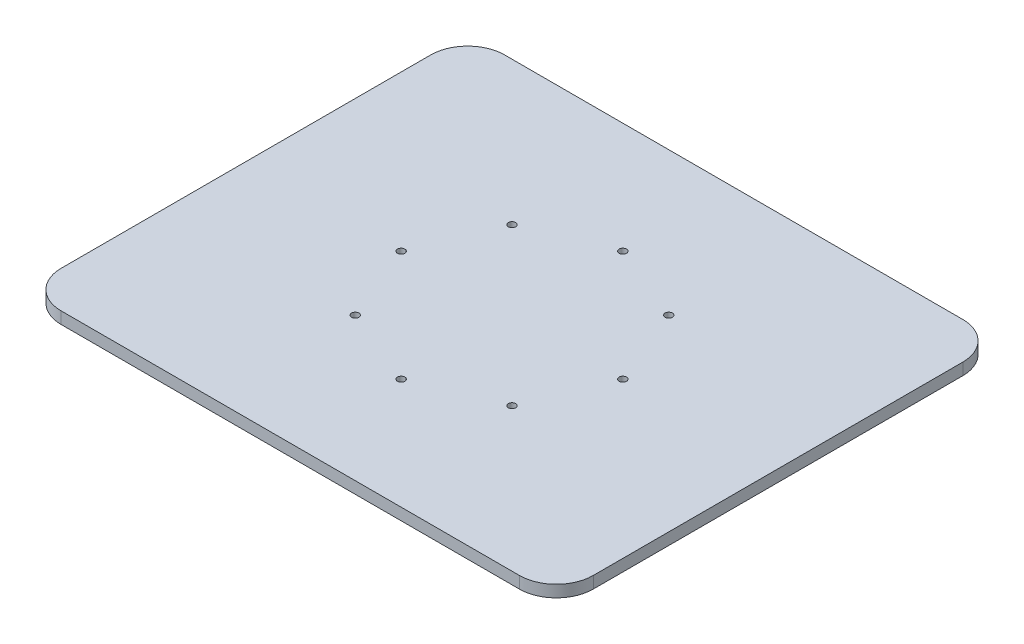
ISO-10303-21;
HEADER;
FILE_DESCRIPTION(('STEP AP214'),'2;1');
FILE_NAME('part.step','',(''),(''),'','','');
FILE_SCHEMA(('AUTOMOTIVE_DESIGN { 1 0 10303 214 1 1 1 1 }'));
ENDSEC;
DATA;
#1=APPLICATION_CONTEXT('core data for automotive mechanical design processes');
#2=APPLICATION_PROTOCOL_DEFINITION('international standard','automotive_design',2000,#1);
#3=PRODUCT_CONTEXT('',#1,'mechanical');
#4=PRODUCT('Part','Part','',(#3));
#5=PRODUCT_RELATED_PRODUCT_CATEGORY('part','',(#4));
#6=PRODUCT_DEFINITION_FORMATION('','',#4);
#7=PRODUCT_DEFINITION_CONTEXT('part definition',#1,'design');
#8=PRODUCT_DEFINITION('design','',#6,#7);
#9=PRODUCT_DEFINITION_SHAPE('','',#8);
#10=(LENGTH_UNIT() NAMED_UNIT(*) SI_UNIT(.MILLI.,.METRE.));
#11=(NAMED_UNIT(*) PLANE_ANGLE_UNIT() SI_UNIT($,.RADIAN.));
#12=(NAMED_UNIT(*) SI_UNIT($,.STERADIAN.) SOLID_ANGLE_UNIT());
#13=UNCERTAINTY_MEASURE_WITH_UNIT(LENGTH_MEASURE(1.E-05),#10,'distance_accuracy_value','');
#14=(GEOMETRIC_REPRESENTATION_CONTEXT(3) GLOBAL_UNCERTAINTY_ASSIGNED_CONTEXT((#13)) GLOBAL_UNIT_ASSIGNED_CONTEXT((#10,
#11,#12)) REPRESENTATION_CONTEXT('',''));
#15=CARTESIAN_POINT('',(0.,0.,0.));
#16=DIRECTION('',(0.,0.,1.));
#17=DIRECTION('',(1.,0.,0.));
#18=AXIS2_PLACEMENT_3D('',#15,#16,#17);
#19=CARTESIAN_POINT('',(-360.,0.,-300.));
#20=DIRECTION('',(-1.,0.,0.));
#21=DIRECTION('',(0.,0.,1.));
#22=AXIS2_PLACEMENT_3D('',#19,#20,#21);
#23=PLANE('',#22);
#24=DIRECTION('',(0.,0.,1.));
#25=VECTOR('',#24,1.);
#26=CARTESIAN_POINT('',(-360.,0.,-300.));
#27=LINE('',#26,#25);
#28=CARTESIAN_POINT('',(-360.,0.,-250.));
#29=VERTEX_POINT('',#28);
#30=CARTESIAN_POINT('',(-360.,0.,250.));
#31=VERTEX_POINT('',#30);
#32=EDGE_CURVE('E181',#29,#31,#27,.T.);
#33=ORIENTED_EDGE('',*,*,#32,.T.);
#34=DIRECTION('',(0.,1.,0.));
#35=VECTOR('',#34,1.);
#36=CARTESIAN_POINT('',(-360.,0.,250.));
#37=LINE('',#36,#35);
#38=CARTESIAN_POINT('',(-360.,16.,250.));
#39=VERTEX_POINT('',#38);
#40=EDGE_CURVE('E11',#31,#39,#37,.T.);
#41=ORIENTED_EDGE('',*,*,#40,.T.);
#42=DIRECTION('',(0.,0.,1.));
#43=VECTOR('',#42,1.);
#44=CARTESIAN_POINT('',(-360.,16.,-300.));
#45=LINE('',#44,#43);
#46=CARTESIAN_POINT('',(-360.,16.,-250.));
#47=VERTEX_POINT('',#46);
#48=EDGE_CURVE('E188',#47,#39,#45,.T.);
#49=ORIENTED_EDGE('',*,*,#48,.F.);
#50=DIRECTION('',(0.,1.,0.));
#51=VECTOR('',#50,1.);
#52=CARTESIAN_POINT('',(-360.,0.,-250.));
#53=LINE('',#52,#51);
#54=EDGE_CURVE('E53',#47,#29,#53,.F.);
#55=ORIENTED_EDGE('',*,*,#54,.T.);
#56=EDGE_LOOP('',(#33,#41,#49,#55));
#57=FACE_BOUND('',#56,.T.);
#58=ADVANCED_FACE('F44',(#57),#23,.T.);
#59=CARTESIAN_POINT('',(360.,0.,-300.));
#60=DIRECTION('',(0.,0.,-1.));
#61=DIRECTION('',(-1.,0.,0.));
#62=AXIS2_PLACEMENT_3D('',#59,#60,#61);
#63=PLANE('',#62);
#64=DIRECTION('',(-1.,0.,0.));
#65=VECTOR('',#64,1.);
#66=CARTESIAN_POINT('',(360.,16.,-300.));
#67=LINE('',#66,#65);
#68=CARTESIAN_POINT('',(310.,16.,-300.));
#69=VERTEX_POINT('',#68);
#70=CARTESIAN_POINT('',(-310.,16.,-300.));
#71=VERTEX_POINT('',#70);
#72=EDGE_CURVE('E132',#69,#71,#67,.T.);
#73=ORIENTED_EDGE('',*,*,#72,.F.);
#74=DIRECTION('',(0.,1.,0.));
#75=VECTOR('',#74,1.);
#76=CARTESIAN_POINT('',(310.,0.,-300.));
#77=LINE('',#76,#75);
#78=CARTESIAN_POINT('',(310.,0.,-300.));
#79=VERTEX_POINT('',#78);
#80=EDGE_CURVE('E157',#69,#79,#77,.F.);
#81=ORIENTED_EDGE('',*,*,#80,.T.);
#82=DIRECTION('',(-1.,0.,0.));
#83=VECTOR('',#82,1.);
#84=CARTESIAN_POINT('',(360.,0.,-300.));
#85=LINE('',#84,#83);
#86=CARTESIAN_POINT('',(-310.,0.,-300.));
#87=VERTEX_POINT('',#86);
#88=EDGE_CURVE('E138',#79,#87,#85,.T.);
#89=ORIENTED_EDGE('',*,*,#88,.T.);
#90=DIRECTION('',(0.,1.,0.));
#91=VECTOR('',#90,1.);
#92=CARTESIAN_POINT('',(-310.,0.,-300.));
#93=LINE('',#92,#91);
#94=EDGE_CURVE('E154',#87,#71,#93,.T.);
#95=ORIENTED_EDGE('',*,*,#94,.T.);
#96=EDGE_LOOP('',(#73,#81,#89,#95));
#97=FACE_BOUND('',#96,.T.);
#98=ADVANCED_FACE('F200',(#97),#63,.T.);
#99=CARTESIAN_POINT('',(360.,0.,300.));
#100=DIRECTION('',(1.,0.,0.));
#101=DIRECTION('',(0.,0.,-1.));
#102=AXIS2_PLACEMENT_3D('',#99,#100,#101);
#103=PLANE('',#102);
#104=DIRECTION('',(0.,0.,-1.));
#105=VECTOR('',#104,1.);
#106=CARTESIAN_POINT('',(360.,0.,300.));
#107=LINE('',#106,#105);
#108=CARTESIAN_POINT('',(360.,0.,250.));
#109=VERTEX_POINT('',#108);
#110=CARTESIAN_POINT('',(360.,0.,-250.));
#111=VERTEX_POINT('',#110);
#112=EDGE_CURVE('E144',#109,#111,#107,.T.);
#113=ORIENTED_EDGE('',*,*,#112,.T.);
#114=DIRECTION('',(0.,1.,0.));
#115=VECTOR('',#114,1.);
#116=CARTESIAN_POINT('',(360.,0.,-250.));
#117=LINE('',#116,#115);
#118=CARTESIAN_POINT('',(360.,16.,-250.));
#119=VERTEX_POINT('',#118);
#120=EDGE_CURVE('E135',#111,#119,#117,.T.);
#121=ORIENTED_EDGE('',*,*,#120,.T.);
#122=DIRECTION('',(0.,0.,-1.));
#123=VECTOR('',#122,1.);
#124=CARTESIAN_POINT('',(360.,16.,300.));
#125=LINE('',#124,#123);
#126=CARTESIAN_POINT('',(360.,16.,250.));
#127=VERTEX_POINT('',#126);
#128=EDGE_CURVE('E118',#127,#119,#125,.T.);
#129=ORIENTED_EDGE('',*,*,#128,.F.);
#130=DIRECTION('',(0.,1.,0.));
#131=VECTOR('',#130,1.);
#132=CARTESIAN_POINT('',(360.,0.,250.));
#133=LINE('',#132,#131);
#134=EDGE_CURVE('E128',#127,#109,#133,.F.);
#135=ORIENTED_EDGE('',*,*,#134,.T.);
#136=EDGE_LOOP('',(#113,#121,#129,#135));
#137=FACE_BOUND('',#136,.T.);
#138=ADVANCED_FACE('F129',(#137),#103,.T.);
#139=CARTESIAN_POINT('',(-360.,0.,300.));
#140=DIRECTION('',(0.,0.,1.));
#141=DIRECTION('',(1.,0.,0.));
#142=AXIS2_PLACEMENT_3D('',#139,#140,#141);
#143=PLANE('',#142);
#144=DIRECTION('',(1.,0.,0.));
#145=VECTOR('',#144,1.);
#146=CARTESIAN_POINT('',(-360.,0.,300.));
#147=LINE('',#146,#145);
#148=CARTESIAN_POINT('',(-310.,0.,300.));
#149=VERTEX_POINT('',#148);
#150=CARTESIAN_POINT('',(310.,0.,300.));
#151=VERTEX_POINT('',#150);
#152=EDGE_CURVE('E193',#149,#151,#147,.T.);
#153=ORIENTED_EDGE('',*,*,#152,.T.);
#154=DIRECTION('',(0.,1.,0.));
#155=VECTOR('',#154,1.);
#156=CARTESIAN_POINT('',(310.,0.,300.));
#157=LINE('',#156,#155);
#158=CARTESIAN_POINT('',(310.,16.,300.));
#159=VERTEX_POINT('',#158);
#160=EDGE_CURVE('E174',#151,#159,#157,.T.);
#161=ORIENTED_EDGE('',*,*,#160,.T.);
#162=DIRECTION('',(1.,0.,0.));
#163=VECTOR('',#162,1.);
#164=CARTESIAN_POINT('',(-360.,16.,300.));
#165=LINE('',#164,#163);
#166=CARTESIAN_POINT('',(-310.,16.,300.));
#167=VERTEX_POINT('',#166);
#168=EDGE_CURVE('E120',#167,#159,#165,.T.);
#169=ORIENTED_EDGE('',*,*,#168,.F.);
#170=DIRECTION('',(0.,1.,0.));
#171=VECTOR('',#170,1.);
#172=CARTESIAN_POINT('',(-310.,0.,300.));
#173=LINE('',#172,#171);
#174=EDGE_CURVE('E68',#167,#149,#173,.F.);
#175=ORIENTED_EDGE('',*,*,#174,.T.);
#176=EDGE_LOOP('',(#153,#161,#169,#175));
#177=FACE_BOUND('',#176,.T.);
#178=ADVANCED_FACE('F361',(#177),#143,.T.);
#179=CARTESIAN_POINT('',(0.,0.,0.));
#180=DIRECTION('',(0.,1.,0.));
#181=DIRECTION('',(0.,0.,1.));
#182=AXIS2_PLACEMENT_3D('',#179,#180,#181);
#183=PLANE('',#182);
#184=CARTESIAN_POINT('',(106.066017178,0.,106.066017178));
#185=DIRECTION('',(0.,1.,0.));
#186=DIRECTION('',(0.,0.,1.));
#187=AXIS2_PLACEMENT_3D('',#184,#185,#186);
#188=CIRCLE('',#187,2.75000000000002);
#189=CARTESIAN_POINT('',(106.066017178,0.,108.816017178));
#190=VERTEX_POINT('',#189);
#191=EDGE_CURVE('E317',#190,#190,#188,.T.);
#192=ORIENTED_EDGE('',*,*,#191,.T.);
#193=EDGE_LOOP('',(#192));
#194=FACE_BOUND('',#193,.T.);
#195=CARTESIAN_POINT('',(0.,0.,150.));
#196=DIRECTION('',(0.,1.,0.));
#197=DIRECTION('',(0.,0.,1.));
#198=AXIS2_PLACEMENT_3D('',#195,#196,#197);
#199=CIRCLE('',#198,2.75000000000001);
#200=CARTESIAN_POINT('',(0.,0.,152.75));
#201=VERTEX_POINT('',#200);
#202=EDGE_CURVE('E303',#201,#201,#199,.T.);
#203=ORIENTED_EDGE('',*,*,#202,.T.);
#204=EDGE_LOOP('',(#203));
#205=FACE_BOUND('',#204,.T.);
#206=CARTESIAN_POINT('',(-106.066017178,0.,106.066017178));
#207=DIRECTION('',(0.,1.,0.));
#208=DIRECTION('',(0.,0.,1.));
#209=AXIS2_PLACEMENT_3D('',#206,#207,#208);
#210=CIRCLE('',#209,2.75000000000002);
#211=CARTESIAN_POINT('',(-106.066017178,0.,108.816017178));
#212=VERTEX_POINT('',#211);
#213=EDGE_CURVE('E290',#212,#212,#210,.T.);
#214=ORIENTED_EDGE('',*,*,#213,.T.);
#215=EDGE_LOOP('',(#214));
#216=FACE_BOUND('',#215,.T.);
#217=CARTESIAN_POINT('',(-150.,0.,0.));
#218=DIRECTION('',(0.,1.,0.));
#219=DIRECTION('',(0.,0.,1.));
#220=AXIS2_PLACEMENT_3D('',#217,#218,#219);
#221=CIRCLE('',#220,2.75);
#222=CARTESIAN_POINT('',(-150.,0.,2.74999999999998));
#223=VERTEX_POINT('',#222);
#224=EDGE_CURVE('E271',#223,#223,#221,.T.);
#225=ORIENTED_EDGE('',*,*,#224,.T.);
#226=EDGE_LOOP('',(#225));
#227=FACE_BOUND('',#226,.T.);
#228=CARTESIAN_POINT('',(-106.066017178,0.,-106.066017178));
#229=DIRECTION('',(0.,1.,0.));
#230=DIRECTION('',(0.,0.,1.));
#231=AXIS2_PLACEMENT_3D('',#228,#229,#230);
#232=CIRCLE('',#231,2.75000000000002);
#233=CARTESIAN_POINT('',(-106.066017178,0.,-103.316017178));
#234=VERTEX_POINT('',#233);
#235=EDGE_CURVE('E254',#234,#234,#232,.T.);
#236=ORIENTED_EDGE('',*,*,#235,.T.);
#237=EDGE_LOOP('',(#236));
#238=FACE_BOUND('',#237,.T.);
#239=CARTESIAN_POINT('',(0.,0.,-150.));
#240=DIRECTION('',(0.,1.,0.));
#241=DIRECTION('',(0.,0.,1.));
#242=AXIS2_PLACEMENT_3D('',#239,#240,#241);
#243=CIRCLE('',#242,2.75000000000001);
#244=CARTESIAN_POINT('',(0.,0.,-147.25));
#245=VERTEX_POINT('',#244);
#246=EDGE_CURVE('E239',#245,#245,#243,.T.);
#247=ORIENTED_EDGE('',*,*,#246,.T.);
#248=EDGE_LOOP('',(#247));
#249=FACE_BOUND('',#248,.T.);
#250=CARTESIAN_POINT('',(106.066017178,0.,-106.066017178));
#251=DIRECTION('',(0.,1.,0.));
#252=DIRECTION('',(0.,0.,1.));
#253=AXIS2_PLACEMENT_3D('',#250,#251,#252);
#254=CIRCLE('',#253,2.75000000000002);
#255=CARTESIAN_POINT('',(106.066017178,0.,-103.316017178));
#256=VERTEX_POINT('',#255);
#257=EDGE_CURVE('E224',#256,#256,#254,.T.);
#258=ORIENTED_EDGE('',*,*,#257,.T.);
#259=EDGE_LOOP('',(#258));
#260=FACE_BOUND('',#259,.T.);
#261=CARTESIAN_POINT('',(150.,0.,0.));
#262=DIRECTION('',(0.,1.,0.));
#263=DIRECTION('',(0.,0.,1.));
#264=AXIS2_PLACEMENT_3D('',#261,#262,#263);
#265=CIRCLE('',#264,2.75);
#266=CARTESIAN_POINT('',(150.,0.,2.75));
#267=VERTEX_POINT('',#266);
#268=EDGE_CURVE('E210',#267,#267,#265,.T.);
#269=ORIENTED_EDGE('',*,*,#268,.T.);
#270=EDGE_LOOP('',(#269));
#271=FACE_BOUND('',#270,.T.);
#272=ORIENTED_EDGE('',*,*,#88,.F.);
#273=CARTESIAN_POINT('',(310.,0.,-250.));
#274=DIRECTION('',(0.,1.,0.));
#275=DIRECTION('',(0.,0.,1.));
#276=AXIS2_PLACEMENT_3D('',#273,#274,#275);
#277=CIRCLE('',#276,50.);
#278=EDGE_CURVE('E168',#79,#111,#277,.F.);
#279=ORIENTED_EDGE('',*,*,#278,.T.);
#280=ORIENTED_EDGE('',*,*,#112,.F.);
#281=CARTESIAN_POINT('',(310.,0.,250.));
#282=DIRECTION('',(0.,1.,0.));
#283=DIRECTION('',(0.,0.,1.));
#284=AXIS2_PLACEMENT_3D('',#281,#282,#283);
#285=CIRCLE('',#284,50.);
#286=EDGE_CURVE('E63',#109,#151,#285,.F.);
#287=ORIENTED_EDGE('',*,*,#286,.T.);
#288=ORIENTED_EDGE('',*,*,#152,.F.);
#289=CARTESIAN_POINT('',(-310.,0.,250.));
#290=DIRECTION('',(0.,1.,0.));
#291=DIRECTION('',(0.,0.,1.));
#292=AXIS2_PLACEMENT_3D('',#289,#290,#291);
#293=CIRCLE('',#292,50.);
#294=EDGE_CURVE('E164',#149,#31,#293,.F.);
#295=ORIENTED_EDGE('',*,*,#294,.T.);
#296=ORIENTED_EDGE('',*,*,#32,.F.);
#297=CARTESIAN_POINT('',(-310.,0.,-250.));
#298=DIRECTION('',(0.,1.,0.));
#299=DIRECTION('',(0.,0.,1.));
#300=AXIS2_PLACEMENT_3D('',#297,#298,#299);
#301=CIRCLE('',#300,50.);
#302=EDGE_CURVE('E165',#29,#87,#301,.F.);
#303=ORIENTED_EDGE('',*,*,#302,.T.);
#304=EDGE_LOOP('',(#272,#279,#280,#287,#288,#295,#296,#303));
#305=FACE_BOUND('',#304,.T.);
#306=ADVANCED_FACE('F189',(#194,#205,#216,#227,#238,#249,#260,#271,#305),#183,.F.);
#307=CARTESIAN_POINT('',(0.,16.,0.));
#308=DIRECTION('',(0.,1.,0.));
#309=DIRECTION('',(0.,0.,1.));
#310=AXIS2_PLACEMENT_3D('',#307,#308,#309);
#311=PLANE('',#310);
#312=CARTESIAN_POINT('',(106.066017178,16.,106.066017178));
#313=DIRECTION('',(0.,1.,0.));
#314=DIRECTION('',(0.,0.,1.));
#315=AXIS2_PLACEMENT_3D('',#312,#313,#314);
#316=CIRCLE('',#315,5.);
#317=CARTESIAN_POINT('',(106.066017178,16.,111.066017178));
#318=VERTEX_POINT('',#317);
#319=EDGE_CURVE('E332',#318,#318,#316,.T.);
#320=ORIENTED_EDGE('',*,*,#319,.F.);
#321=EDGE_LOOP('',(#320));
#322=FACE_BOUND('',#321,.T.);
#323=CARTESIAN_POINT('',(0.,16.,150.));
#324=DIRECTION('',(0.,1.,0.));
#325=DIRECTION('',(0.,0.,1.));
#326=AXIS2_PLACEMENT_3D('',#323,#324,#325);
#327=CIRCLE('',#326,5.);
#328=CARTESIAN_POINT('',(0.,16.,155.));
#329=VERTEX_POINT('',#328);
#330=EDGE_CURVE('E312',#329,#329,#327,.T.);
#331=ORIENTED_EDGE('',*,*,#330,.F.);
#332=EDGE_LOOP('',(#331));
#333=FACE_BOUND('',#332,.T.);
#334=CARTESIAN_POINT('',(-106.066017178,16.,106.066017178));
#335=DIRECTION('',(0.,1.,0.));
#336=DIRECTION('',(0.,0.,1.));
#337=AXIS2_PLACEMENT_3D('',#334,#335,#336);
#338=CIRCLE('',#337,5.);
#339=CARTESIAN_POINT('',(-106.066017178,16.,111.066017178));
#340=VERTEX_POINT('',#339);
#341=EDGE_CURVE('E297',#340,#340,#338,.T.);
#342=ORIENTED_EDGE('',*,*,#341,.F.);
#343=EDGE_LOOP('',(#342));
#344=FACE_BOUND('',#343,.T.);
#345=CARTESIAN_POINT('',(-150.,16.,0.));
#346=DIRECTION('',(0.,1.,0.));
#347=DIRECTION('',(0.,0.,1.));
#348=AXIS2_PLACEMENT_3D('',#345,#346,#347);
#349=CIRCLE('',#348,5.);
#350=CARTESIAN_POINT('',(-150.,16.,4.99999999999999));
#351=VERTEX_POINT('',#350);
#352=EDGE_CURVE('E281',#351,#351,#349,.T.);
#353=ORIENTED_EDGE('',*,*,#352,.F.);
#354=EDGE_LOOP('',(#353));
#355=FACE_BOUND('',#354,.T.);
#356=CARTESIAN_POINT('',(-106.066017178,16.,-106.066017178));
#357=DIRECTION('',(0.,1.,0.));
#358=DIRECTION('',(0.,0.,1.));
#359=AXIS2_PLACEMENT_3D('',#356,#357,#358);
#360=CIRCLE('',#359,5.);
#361=CARTESIAN_POINT('',(-106.066017178,16.,-101.066017178));
#362=VERTEX_POINT('',#361);
#363=EDGE_CURVE('E270',#362,#362,#360,.T.);
#364=ORIENTED_EDGE('',*,*,#363,.F.);
#365=EDGE_LOOP('',(#364));
#366=FACE_BOUND('',#365,.T.);
#367=CARTESIAN_POINT('',(0.,16.,-150.));
#368=DIRECTION('',(0.,1.,0.));
#369=DIRECTION('',(0.,0.,1.));
#370=AXIS2_PLACEMENT_3D('',#367,#368,#369);
#371=CIRCLE('',#370,5.);
#372=CARTESIAN_POINT('',(0.,16.,-145.));
#373=VERTEX_POINT('',#372);
#374=EDGE_CURVE('E253',#373,#373,#371,.T.);
#375=ORIENTED_EDGE('',*,*,#374,.F.);
#376=EDGE_LOOP('',(#375));
#377=FACE_BOUND('',#376,.T.);
#378=CARTESIAN_POINT('',(106.066017178,16.,-106.066017178));
#379=DIRECTION('',(0.,1.,0.));
#380=DIRECTION('',(0.,0.,1.));
#381=AXIS2_PLACEMENT_3D('',#378,#379,#380);
#382=CIRCLE('',#381,5.);
#383=CARTESIAN_POINT('',(106.066017178,16.,-101.066017178));
#384=VERTEX_POINT('',#383);
#385=EDGE_CURVE('E231',#384,#384,#382,.T.);
#386=ORIENTED_EDGE('',*,*,#385,.F.);
#387=EDGE_LOOP('',(#386));
#388=FACE_BOUND('',#387,.T.);
#389=CARTESIAN_POINT('',(150.,16.,0.));
#390=DIRECTION('',(0.,1.,0.));
#391=DIRECTION('',(0.,0.,1.));
#392=AXIS2_PLACEMENT_3D('',#389,#390,#391);
#393=CIRCLE('',#392,5.);
#394=CARTESIAN_POINT('',(150.,16.,5.));
#395=VERTEX_POINT('',#394);
#396=EDGE_CURVE('E218',#395,#395,#393,.T.);
#397=ORIENTED_EDGE('',*,*,#396,.F.);
#398=EDGE_LOOP('',(#397));
#399=FACE_BOUND('',#398,.T.);
#400=ORIENTED_EDGE('',*,*,#128,.T.);
#401=CARTESIAN_POINT('',(310.,16.,-250.));
#402=DIRECTION('',(0.,1.,0.));
#403=DIRECTION('',(0.,0.,1.));
#404=AXIS2_PLACEMENT_3D('',#401,#402,#403);
#405=CIRCLE('',#404,50.);
#406=EDGE_CURVE('E123',#119,#69,#405,.T.);
#407=ORIENTED_EDGE('',*,*,#406,.T.);
#408=ORIENTED_EDGE('',*,*,#72,.T.);
#409=CARTESIAN_POINT('',(-310.,16.,-250.));
#410=DIRECTION('',(0.,1.,0.));
#411=DIRECTION('',(0.,0.,1.));
#412=AXIS2_PLACEMENT_3D('',#409,#410,#411);
#413=CIRCLE('',#412,50.);
#414=EDGE_CURVE('E142',#71,#47,#413,.T.);
#415=ORIENTED_EDGE('',*,*,#414,.T.);
#416=ORIENTED_EDGE('',*,*,#48,.T.);
#417=CARTESIAN_POINT('',(-310.,16.,250.));
#418=DIRECTION('',(0.,1.,0.));
#419=DIRECTION('',(0.,0.,1.));
#420=AXIS2_PLACEMENT_3D('',#417,#418,#419);
#421=CIRCLE('',#420,50.);
#422=EDGE_CURVE('E124',#39,#167,#421,.T.);
#423=ORIENTED_EDGE('',*,*,#422,.T.);
#424=ORIENTED_EDGE('',*,*,#168,.T.);
#425=CARTESIAN_POINT('',(310.,16.,250.));
#426=DIRECTION('',(0.,1.,0.));
#427=DIRECTION('',(0.,0.,1.));
#428=AXIS2_PLACEMENT_3D('',#425,#426,#427);
#429=CIRCLE('',#428,50.);
#430=EDGE_CURVE('E114',#159,#127,#429,.T.);
#431=ORIENTED_EDGE('',*,*,#430,.T.);
#432=EDGE_LOOP('',(#400,#407,#408,#415,#416,#423,#424,#431));
#433=FACE_BOUND('',#432,.T.);
#434=ADVANCED_FACE('F113',(#322,#333,#344,#355,#366,#377,#388,#399,#433),#311,.T.);
#435=CARTESIAN_POINT('',(150.,16.,0.));
#436=DIRECTION('',(0.,1.,0.));
#437=DIRECTION('',(0.,0.,1.));
#438=AXIS2_PLACEMENT_3D('',#435,#436,#437);
#439=CYLINDRICAL_SURFACE('',#438,2.75);
#440=ORIENTED_EDGE('',*,*,#268,.F.);
#441=EDGE_LOOP('',(#440));
#442=FACE_BOUND('',#441,.T.);
#443=CARTESIAN_POINT('',(150.,3.99999999999999,0.));
#444=DIRECTION('',(0.,1.,0.));
#445=DIRECTION('',(0.,0.,1.));
#446=AXIS2_PLACEMENT_3D('',#443,#444,#445);
#447=CIRCLE('',#446,2.75);
#448=CARTESIAN_POINT('',(150.,3.99999999999999,2.75));
#449=VERTEX_POINT('',#448);
#450=EDGE_CURVE('E211',#449,#449,#447,.T.);
#451=ORIENTED_EDGE('',*,*,#450,.T.);
#452=EDGE_LOOP('',(#451));
#453=FACE_BOUND('',#452,.T.);
#454=ADVANCED_FACE('F369',(#442,#453),#439,.F.);
#455=CARTESIAN_POINT('',(152.75,3.99999999999999,0.));
#456=DIRECTION('',(0.,-1.,0.));
#457=DIRECTION('',(0.,0.,-1.));
#458=AXIS2_PLACEMENT_3D('',#455,#456,#457);
#459=PLANE('',#458);
#460=ORIENTED_EDGE('',*,*,#450,.F.);
#461=EDGE_LOOP('',(#460));
#462=FACE_BOUND('',#461,.T.);
#463=CARTESIAN_POINT('',(150.,3.99999999999999,0.));
#464=DIRECTION('',(0.,1.,0.));
#465=DIRECTION('',(0.,0.,1.));
#466=AXIS2_PLACEMENT_3D('',#463,#464,#465);
#467=CIRCLE('',#466,5.);
#468=CARTESIAN_POINT('',(150.,3.99999999999999,5.));
#469=VERTEX_POINT('',#468);
#470=EDGE_CURVE('E214',#469,#469,#467,.T.);
#471=ORIENTED_EDGE('',*,*,#470,.T.);
#472=EDGE_LOOP('',(#471));
#473=FACE_BOUND('',#472,.T.);
#474=ADVANCED_FACE('F376',(#462,#473),#459,.F.);
#475=CARTESIAN_POINT('',(150.,16.,0.));
#476=DIRECTION('',(0.,1.,0.));
#477=DIRECTION('',(0.,0.,1.));
#478=AXIS2_PLACEMENT_3D('',#475,#476,#477);
#479=CYLINDRICAL_SURFACE('',#478,5.);
#480=ORIENTED_EDGE('',*,*,#470,.F.);
#481=EDGE_LOOP('',(#480));
#482=FACE_BOUND('',#481,.T.);
#483=ORIENTED_EDGE('',*,*,#396,.T.);
#484=EDGE_LOOP('',(#483));
#485=FACE_BOUND('',#484,.T.);
#486=ADVANCED_FACE('F379',(#482,#485),#479,.F.);
#487=CARTESIAN_POINT('',(106.066017178,16.,-106.066017178));
#488=DIRECTION('',(0.,1.,0.));
#489=DIRECTION('',(0.,0.,1.));
#490=AXIS2_PLACEMENT_3D('',#487,#488,#489);
#491=CYLINDRICAL_SURFACE('',#490,2.75000000000002);
#492=ORIENTED_EDGE('',*,*,#257,.F.);
#493=EDGE_LOOP('',(#492));
#494=FACE_BOUND('',#493,.T.);
#495=CARTESIAN_POINT('',(106.066017178,3.99999999999999,-106.066017178));
#496=DIRECTION('',(0.,1.,0.));
#497=DIRECTION('',(0.,0.,1.));
#498=AXIS2_PLACEMENT_3D('',#495,#496,#497);
#499=CIRCLE('',#498,2.75000000000002);
#500=CARTESIAN_POINT('',(106.066017178,3.99999999999999,-103.316017178));
#501=VERTEX_POINT('',#500);
#502=EDGE_CURVE('E230',#501,#501,#499,.T.);
#503=ORIENTED_EDGE('',*,*,#502,.T.);
#504=EDGE_LOOP('',(#503));
#505=FACE_BOUND('',#504,.T.);
#506=ADVANCED_FACE('F383',(#494,#505),#491,.F.);
#507=CARTESIAN_POINT('',(108.816017178,3.99999999999999,-106.066017178));
#508=DIRECTION('',(0.,-1.,0.));
#509=DIRECTION('',(0.,0.,-1.));
#510=AXIS2_PLACEMENT_3D('',#507,#508,#509);
#511=PLANE('',#510);
#512=ORIENTED_EDGE('',*,*,#502,.F.);
#513=EDGE_LOOP('',(#512));
#514=FACE_BOUND('',#513,.T.);
#515=CARTESIAN_POINT('',(106.066017178,3.99999999999999,-106.066017178));
#516=DIRECTION('',(0.,1.,0.));
#517=DIRECTION('',(0.,0.,1.));
#518=AXIS2_PLACEMENT_3D('',#515,#516,#517);
#519=CIRCLE('',#518,5.);
#520=CARTESIAN_POINT('',(106.066017178,3.99999999999999,-101.066017178));
#521=VERTEX_POINT('',#520);
#522=EDGE_CURVE('E232',#521,#521,#519,.T.);
#523=ORIENTED_EDGE('',*,*,#522,.T.);
#524=EDGE_LOOP('',(#523));
#525=FACE_BOUND('',#524,.T.);
#526=ADVANCED_FACE('F389',(#514,#525),#511,.F.);
#527=CARTESIAN_POINT('',(106.066017178,16.,-106.066017178));
#528=DIRECTION('',(0.,1.,0.));
#529=DIRECTION('',(0.,0.,1.));
#530=AXIS2_PLACEMENT_3D('',#527,#528,#529);
#531=CYLINDRICAL_SURFACE('',#530,5.);
#532=ORIENTED_EDGE('',*,*,#522,.F.);
#533=EDGE_LOOP('',(#532));
#534=FACE_BOUND('',#533,.T.);
#535=ORIENTED_EDGE('',*,*,#385,.T.);
#536=EDGE_LOOP('',(#535));
#537=FACE_BOUND('',#536,.T.);
#538=ADVANCED_FACE('F395',(#534,#537),#531,.F.);
#539=CARTESIAN_POINT('',(0.,16.,-150.));
#540=DIRECTION('',(0.,1.,0.));
#541=DIRECTION('',(0.,0.,1.));
#542=AXIS2_PLACEMENT_3D('',#539,#540,#541);
#543=CYLINDRICAL_SURFACE('',#542,2.75000000000001);
#544=ORIENTED_EDGE('',*,*,#246,.F.);
#545=EDGE_LOOP('',(#544));
#546=FACE_BOUND('',#545,.T.);
#547=CARTESIAN_POINT('',(0.,3.99999999999999,-150.));
#548=DIRECTION('',(0.,1.,0.));
#549=DIRECTION('',(0.,0.,1.));
#550=AXIS2_PLACEMENT_3D('',#547,#548,#549);
#551=CIRCLE('',#550,2.75000000000001);
#552=CARTESIAN_POINT('',(0.,3.99999999999999,-147.25));
#553=VERTEX_POINT('',#552);
#554=EDGE_CURVE('E241',#553,#553,#551,.T.);
#555=ORIENTED_EDGE('',*,*,#554,.T.);
#556=EDGE_LOOP('',(#555));
#557=FACE_BOUND('',#556,.T.);
#558=ADVANCED_FACE('F397',(#546,#557),#543,.F.);
#559=CARTESIAN_POINT('',(2.75000000000001,3.99999999999999,-150.));
#560=DIRECTION('',(0.,-1.,0.));
#561=DIRECTION('',(0.,0.,-1.));
#562=AXIS2_PLACEMENT_3D('',#559,#560,#561);
#563=PLANE('',#562);
#564=ORIENTED_EDGE('',*,*,#554,.F.);
#565=EDGE_LOOP('',(#564));
#566=FACE_BOUND('',#565,.T.);
#567=CARTESIAN_POINT('',(0.,3.99999999999999,-150.));
#568=DIRECTION('',(0.,1.,0.));
#569=DIRECTION('',(0.,0.,1.));
#570=AXIS2_PLACEMENT_3D('',#567,#568,#569);
#571=CIRCLE('',#570,5.);
#572=CARTESIAN_POINT('',(0.,3.99999999999999,-145.));
#573=VERTEX_POINT('',#572);
#574=EDGE_CURVE('E250',#573,#573,#571,.T.);
#575=ORIENTED_EDGE('',*,*,#574,.T.);
#576=EDGE_LOOP('',(#575));
#577=FACE_BOUND('',#576,.T.);
#578=ADVANCED_FACE('F396',(#566,#577),#563,.F.);
#579=CARTESIAN_POINT('',(0.,16.,-150.));
#580=DIRECTION('',(0.,1.,0.));
#581=DIRECTION('',(0.,0.,1.));
#582=AXIS2_PLACEMENT_3D('',#579,#580,#581);
#583=CYLINDRICAL_SURFACE('',#582,5.);
#584=ORIENTED_EDGE('',*,*,#574,.F.);
#585=EDGE_LOOP('',(#584));
#586=FACE_BOUND('',#585,.T.);
#587=ORIENTED_EDGE('',*,*,#374,.T.);
#588=EDGE_LOOP('',(#587));
#589=FACE_BOUND('',#588,.T.);
#590=ADVANCED_FACE('F404',(#586,#589),#583,.F.);
#591=CARTESIAN_POINT('',(-106.066017178,16.,-106.066017178));
#592=DIRECTION('',(0.,1.,0.));
#593=DIRECTION('',(0.,0.,1.));
#594=AXIS2_PLACEMENT_3D('',#591,#592,#593);
#595=CYLINDRICAL_SURFACE('',#594,2.75000000000002);
#596=ORIENTED_EDGE('',*,*,#235,.F.);
#597=EDGE_LOOP('',(#596));
#598=FACE_BOUND('',#597,.T.);
#599=CARTESIAN_POINT('',(-106.066017178,3.99999999999999,-106.066017178));
#600=DIRECTION('',(0.,1.,0.));
#601=DIRECTION('',(0.,0.,1.));
#602=AXIS2_PLACEMENT_3D('',#599,#600,#601);
#603=CIRCLE('',#602,2.75000000000002);
#604=CARTESIAN_POINT('',(-106.066017178,3.99999999999999,-103.316017178));
#605=VERTEX_POINT('',#604);
#606=EDGE_CURVE('E259',#605,#605,#603,.T.);
#607=ORIENTED_EDGE('',*,*,#606,.T.);
#608=EDGE_LOOP('',(#607));
#609=FACE_BOUND('',#608,.T.);
#610=ADVANCED_FACE('F406',(#598,#609),#595,.F.);
#611=CARTESIAN_POINT('',(-103.316017178,3.99999999999999,-106.066017178));
#612=DIRECTION('',(0.,-1.,0.));
#613=DIRECTION('',(0.,0.,-1.));
#614=AXIS2_PLACEMENT_3D('',#611,#612,#613);
#615=PLANE('',#614);
#616=ORIENTED_EDGE('',*,*,#606,.F.);
#617=EDGE_LOOP('',(#616));
#618=FACE_BOUND('',#617,.T.);
#619=CARTESIAN_POINT('',(-106.066017178,3.99999999999999,-106.066017178));
#620=DIRECTION('',(0.,1.,0.));
#621=DIRECTION('',(0.,0.,1.));
#622=AXIS2_PLACEMENT_3D('',#619,#620,#621);
#623=CIRCLE('',#622,5.);
#624=CARTESIAN_POINT('',(-106.066017178,3.99999999999999,-101.066017178));
#625=VERTEX_POINT('',#624);
#626=EDGE_CURVE('E263',#625,#625,#623,.T.);
#627=ORIENTED_EDGE('',*,*,#626,.T.);
#628=EDGE_LOOP('',(#627));
#629=FACE_BOUND('',#628,.T.);
#630=ADVANCED_FACE('F415',(#618,#629),#615,.F.);
#631=CARTESIAN_POINT('',(-106.066017178,16.,-106.066017178));
#632=DIRECTION('',(0.,1.,0.));
#633=DIRECTION('',(0.,0.,1.));
#634=AXIS2_PLACEMENT_3D('',#631,#632,#633);
#635=CYLINDRICAL_SURFACE('',#634,5.);
#636=ORIENTED_EDGE('',*,*,#626,.F.);
#637=EDGE_LOOP('',(#636));
#638=FACE_BOUND('',#637,.T.);
#639=ORIENTED_EDGE('',*,*,#363,.T.);
#640=EDGE_LOOP('',(#639));
#641=FACE_BOUND('',#640,.T.);
#642=ADVANCED_FACE('F418',(#638,#641),#635,.F.);
#643=CARTESIAN_POINT('',(-150.,16.,0.));
#644=DIRECTION('',(0.,1.,0.));
#645=DIRECTION('',(0.,0.,1.));
#646=AXIS2_PLACEMENT_3D('',#643,#644,#645);
#647=CYLINDRICAL_SURFACE('',#646,2.75);
#648=ORIENTED_EDGE('',*,*,#224,.F.);
#649=EDGE_LOOP('',(#648));
#650=FACE_BOUND('',#649,.T.);
#651=CARTESIAN_POINT('',(-150.,3.99999999999999,0.));
#652=DIRECTION('',(0.,1.,0.));
#653=DIRECTION('',(0.,0.,1.));
#654=AXIS2_PLACEMENT_3D('',#651,#652,#653);
#655=CIRCLE('',#654,2.75);
#656=CARTESIAN_POINT('',(-150.,3.99999999999999,2.74999999999998));
#657=VERTEX_POINT('',#656);
#658=EDGE_CURVE('E274',#657,#657,#655,.T.);
#659=ORIENTED_EDGE('',*,*,#658,.T.);
#660=EDGE_LOOP('',(#659));
#661=FACE_BOUND('',#660,.T.);
#662=ADVANCED_FACE('F419',(#650,#661),#647,.F.);
#663=CARTESIAN_POINT('',(-147.25,3.99999999999999,0.));
#664=DIRECTION('',(0.,-1.,0.));
#665=DIRECTION('',(0.,0.,-1.));
#666=AXIS2_PLACEMENT_3D('',#663,#664,#665);
#667=PLANE('',#666);
#668=ORIENTED_EDGE('',*,*,#658,.F.);
#669=EDGE_LOOP('',(#668));
#670=FACE_BOUND('',#669,.T.);
#671=CARTESIAN_POINT('',(-150.,3.99999999999999,0.));
#672=DIRECTION('',(0.,1.,0.));
#673=DIRECTION('',(0.,0.,1.));
#674=AXIS2_PLACEMENT_3D('',#671,#672,#673);
#675=CIRCLE('',#674,5.);
#676=CARTESIAN_POINT('',(-150.,3.99999999999999,4.99999999999999));
#677=VERTEX_POINT('',#676);
#678=EDGE_CURVE('E276',#677,#677,#675,.T.);
#679=ORIENTED_EDGE('',*,*,#678,.T.);
#680=EDGE_LOOP('',(#679));
#681=FACE_BOUND('',#680,.T.);
#682=ADVANCED_FACE('F424',(#670,#681),#667,.F.);
#683=CARTESIAN_POINT('',(-150.,16.,0.));
#684=DIRECTION('',(0.,1.,0.));
#685=DIRECTION('',(0.,0.,1.));
#686=AXIS2_PLACEMENT_3D('',#683,#684,#685);
#687=CYLINDRICAL_SURFACE('',#686,5.);
#688=ORIENTED_EDGE('',*,*,#678,.F.);
#689=EDGE_LOOP('',(#688));
#690=FACE_BOUND('',#689,.T.);
#691=ORIENTED_EDGE('',*,*,#352,.T.);
#692=EDGE_LOOP('',(#691));
#693=FACE_BOUND('',#692,.T.);
#694=ADVANCED_FACE('F428',(#690,#693),#687,.F.);
#695=CARTESIAN_POINT('',(-106.066017178,16.,106.066017178));
#696=DIRECTION('',(0.,1.,0.));
#697=DIRECTION('',(0.,0.,1.));
#698=AXIS2_PLACEMENT_3D('',#695,#696,#697);
#699=CYLINDRICAL_SURFACE('',#698,2.75000000000002);
#700=ORIENTED_EDGE('',*,*,#213,.F.);
#701=EDGE_LOOP('',(#700));
#702=FACE_BOUND('',#701,.T.);
#703=CARTESIAN_POINT('',(-106.066017178,3.99999999999999,106.066017178));
#704=DIRECTION('',(0.,1.,0.));
#705=DIRECTION('',(0.,0.,1.));
#706=AXIS2_PLACEMENT_3D('',#703,#704,#705);
#707=CIRCLE('',#706,2.75000000000002);
#708=CARTESIAN_POINT('',(-106.066017178,3.99999999999999,108.816017178));
#709=VERTEX_POINT('',#708);
#710=EDGE_CURVE('E292',#709,#709,#707,.T.);
#711=ORIENTED_EDGE('',*,*,#710,.T.);
#712=EDGE_LOOP('',(#711));
#713=FACE_BOUND('',#712,.T.);
#714=ADVANCED_FACE('F435',(#702,#713),#699,.F.);
#715=CARTESIAN_POINT('',(-103.316017178,3.99999999999999,106.066017178));
#716=DIRECTION('',(0.,-1.,0.));
#717=DIRECTION('',(0.,0.,-1.));
#718=AXIS2_PLACEMENT_3D('',#715,#716,#717);
#719=PLANE('',#718);
#720=ORIENTED_EDGE('',*,*,#710,.F.);
#721=EDGE_LOOP('',(#720));
#722=FACE_BOUND('',#721,.T.);
#723=CARTESIAN_POINT('',(-106.066017178,3.99999999999999,106.066017178));
#724=DIRECTION('',(0.,1.,0.));
#725=DIRECTION('',(0.,0.,1.));
#726=AXIS2_PLACEMENT_3D('',#723,#724,#725);
#727=CIRCLE('',#726,5.);
#728=CARTESIAN_POINT('',(-106.066017178,3.99999999999999,111.066017178));
#729=VERTEX_POINT('',#728);
#730=EDGE_CURVE('E293',#729,#729,#727,.T.);
#731=ORIENTED_EDGE('',*,*,#730,.T.);
#732=EDGE_LOOP('',(#731));
#733=FACE_BOUND('',#732,.T.);
#734=ADVANCED_FACE('F436',(#722,#733),#719,.F.);
#735=CARTESIAN_POINT('',(-106.066017178,16.,106.066017178));
#736=DIRECTION('',(0.,1.,0.));
#737=DIRECTION('',(0.,0.,1.));
#738=AXIS2_PLACEMENT_3D('',#735,#736,#737);
#739=CYLINDRICAL_SURFACE('',#738,5.);
#740=ORIENTED_EDGE('',*,*,#730,.F.);
#741=EDGE_LOOP('',(#740));
#742=FACE_BOUND('',#741,.T.);
#743=ORIENTED_EDGE('',*,*,#341,.T.);
#744=EDGE_LOOP('',(#743));
#745=FACE_BOUND('',#744,.T.);
#746=ADVANCED_FACE('F439',(#742,#745),#739,.F.);
#747=CARTESIAN_POINT('',(0.,16.,150.));
#748=DIRECTION('',(0.,1.,0.));
#749=DIRECTION('',(0.,0.,1.));
#750=AXIS2_PLACEMENT_3D('',#747,#748,#749);
#751=CYLINDRICAL_SURFACE('',#750,2.75000000000001);
#752=ORIENTED_EDGE('',*,*,#202,.F.);
#753=EDGE_LOOP('',(#752));
#754=FACE_BOUND('',#753,.T.);
#755=CARTESIAN_POINT('',(0.,3.99999999999999,150.));
#756=DIRECTION('',(0.,1.,0.));
#757=DIRECTION('',(0.,0.,1.));
#758=AXIS2_PLACEMENT_3D('',#755,#756,#757);
#759=CIRCLE('',#758,2.75000000000001);
#760=CARTESIAN_POINT('',(0.,3.99999999999999,152.75));
#761=VERTEX_POINT('',#760);
#762=EDGE_CURVE('E307',#761,#761,#759,.T.);
#763=ORIENTED_EDGE('',*,*,#762,.T.);
#764=EDGE_LOOP('',(#763));
#765=FACE_BOUND('',#764,.T.);
#766=ADVANCED_FACE('F441',(#754,#765),#751,.F.);
#767=CARTESIAN_POINT('',(2.74999999999998,3.99999999999999,150.));
#768=DIRECTION('',(0.,-1.,0.));
#769=DIRECTION('',(0.,0.,-1.));
#770=AXIS2_PLACEMENT_3D('',#767,#768,#769);
#771=PLANE('',#770);
#772=ORIENTED_EDGE('',*,*,#762,.F.);
#773=EDGE_LOOP('',(#772));
#774=FACE_BOUND('',#773,.T.);
#775=CARTESIAN_POINT('',(0.,3.99999999999999,150.));
#776=DIRECTION('',(0.,1.,0.));
#777=DIRECTION('',(0.,0.,1.));
#778=AXIS2_PLACEMENT_3D('',#775,#776,#777);
#779=CIRCLE('',#778,5.);
#780=CARTESIAN_POINT('',(0.,3.99999999999999,155.));
#781=VERTEX_POINT('',#780);
#782=EDGE_CURVE('E313',#781,#781,#779,.T.);
#783=ORIENTED_EDGE('',*,*,#782,.T.);
#784=EDGE_LOOP('',(#783));
#785=FACE_BOUND('',#784,.T.);
#786=ADVANCED_FACE('F446',(#774,#785),#771,.F.);
#787=CARTESIAN_POINT('',(0.,16.,150.));
#788=DIRECTION('',(0.,1.,0.));
#789=DIRECTION('',(0.,0.,1.));
#790=AXIS2_PLACEMENT_3D('',#787,#788,#789);
#791=CYLINDRICAL_SURFACE('',#790,5.);
#792=ORIENTED_EDGE('',*,*,#782,.F.);
#793=EDGE_LOOP('',(#792));
#794=FACE_BOUND('',#793,.T.);
#795=ORIENTED_EDGE('',*,*,#330,.T.);
#796=EDGE_LOOP('',(#795));
#797=FACE_BOUND('',#796,.T.);
#798=ADVANCED_FACE('F455',(#794,#797),#791,.F.);
#799=CARTESIAN_POINT('',(106.066017178,16.,106.066017178));
#800=DIRECTION('',(0.,1.,0.));
#801=DIRECTION('',(0.,0.,1.));
#802=AXIS2_PLACEMENT_3D('',#799,#800,#801);
#803=CYLINDRICAL_SURFACE('',#802,2.75000000000002);
#804=ORIENTED_EDGE('',*,*,#191,.F.);
#805=EDGE_LOOP('',(#804));
#806=FACE_BOUND('',#805,.T.);
#807=CARTESIAN_POINT('',(106.066017178,3.99999999999999,106.066017178));
#808=DIRECTION('',(0.,1.,0.));
#809=DIRECTION('',(0.,0.,1.));
#810=AXIS2_PLACEMENT_3D('',#807,#808,#809);
#811=CIRCLE('',#810,2.75000000000002);
#812=CARTESIAN_POINT('',(106.066017178,3.99999999999999,108.816017178));
#813=VERTEX_POINT('',#812);
#814=EDGE_CURVE('E323',#813,#813,#811,.T.);
#815=ORIENTED_EDGE('',*,*,#814,.T.);
#816=EDGE_LOOP('',(#815));
#817=FACE_BOUND('',#816,.T.);
#818=ADVANCED_FACE('F457',(#806,#817),#803,.F.);
#819=CARTESIAN_POINT('',(108.816017178,3.99999999999999,106.066017178));
#820=DIRECTION('',(0.,-1.,0.));
#821=DIRECTION('',(0.,0.,-1.));
#822=AXIS2_PLACEMENT_3D('',#819,#820,#821);
#823=PLANE('',#822);
#824=ORIENTED_EDGE('',*,*,#814,.F.);
#825=EDGE_LOOP('',(#824));
#826=FACE_BOUND('',#825,.T.);
#827=CARTESIAN_POINT('',(106.066017178,3.99999999999999,106.066017178));
#828=DIRECTION('',(0.,1.,0.));
#829=DIRECTION('',(0.,0.,1.));
#830=AXIS2_PLACEMENT_3D('',#827,#828,#829);
#831=CIRCLE('',#830,5.);
#832=CARTESIAN_POINT('',(106.066017178,3.99999999999999,111.066017178));
#833=VERTEX_POINT('',#832);
#834=EDGE_CURVE('E330',#833,#833,#831,.T.);
#835=ORIENTED_EDGE('',*,*,#834,.T.);
#836=EDGE_LOOP('',(#835));
#837=FACE_BOUND('',#836,.T.);
#838=ADVANCED_FACE('F351',(#826,#837),#823,.F.);
#839=CARTESIAN_POINT('',(106.066017178,16.,106.066017178));
#840=DIRECTION('',(0.,1.,0.));
#841=DIRECTION('',(0.,0.,1.));
#842=AXIS2_PLACEMENT_3D('',#839,#840,#841);
#843=CYLINDRICAL_SURFACE('',#842,5.);
#844=ORIENTED_EDGE('',*,*,#834,.F.);
#845=EDGE_LOOP('',(#844));
#846=FACE_BOUND('',#845,.T.);
#847=ORIENTED_EDGE('',*,*,#319,.T.);
#848=EDGE_LOOP('',(#847));
#849=FACE_BOUND('',#848,.T.);
#850=ADVANCED_FACE('F344',(#846,#849),#843,.F.);
#851=CARTESIAN_POINT('',(310.,0.,-250.));
#852=DIRECTION('',(0.,1.,0.));
#853=DIRECTION('',(0.,0.,1.));
#854=AXIS2_PLACEMENT_3D('',#851,#852,#853);
#855=CYLINDRICAL_SURFACE('',#854,50.);
#856=ORIENTED_EDGE('',*,*,#278,.F.);
#857=ORIENTED_EDGE('',*,*,#80,.F.);
#858=ORIENTED_EDGE('',*,*,#406,.F.);
#859=ORIENTED_EDGE('',*,*,#120,.F.);
#860=EDGE_LOOP('',(#856,#857,#858,#859));
#861=FACE_BOUND('',#860,.T.);
#862=ADVANCED_FACE('F345',(#861),#855,.T.);
#863=CARTESIAN_POINT('',(310.,0.,250.));
#864=DIRECTION('',(0.,1.,0.));
#865=DIRECTION('',(0.,0.,1.));
#866=AXIS2_PLACEMENT_3D('',#863,#864,#865);
#867=CYLINDRICAL_SURFACE('',#866,50.);
#868=ORIENTED_EDGE('',*,*,#286,.F.);
#869=ORIENTED_EDGE('',*,*,#134,.F.);
#870=ORIENTED_EDGE('',*,*,#430,.F.);
#871=ORIENTED_EDGE('',*,*,#160,.F.);
#872=EDGE_LOOP('',(#868,#869,#870,#871));
#873=FACE_BOUND('',#872,.T.);
#874=ADVANCED_FACE('F137',(#873),#867,.T.);
#875=CARTESIAN_POINT('',(-310.,0.,250.));
#876=DIRECTION('',(0.,1.,0.));
#877=DIRECTION('',(0.,0.,1.));
#878=AXIS2_PLACEMENT_3D('',#875,#876,#877);
#879=CYLINDRICAL_SURFACE('',#878,50.);
#880=ORIENTED_EDGE('',*,*,#294,.F.);
#881=ORIENTED_EDGE('',*,*,#174,.F.);
#882=ORIENTED_EDGE('',*,*,#422,.F.);
#883=ORIENTED_EDGE('',*,*,#40,.F.);
#884=EDGE_LOOP('',(#880,#881,#882,#883));
#885=FACE_BOUND('',#884,.T.);
#886=ADVANCED_FACE('F348',(#885),#879,.T.);
#887=CARTESIAN_POINT('',(-310.,0.,-250.));
#888=DIRECTION('',(0.,1.,0.));
#889=DIRECTION('',(0.,0.,1.));
#890=AXIS2_PLACEMENT_3D('',#887,#888,#889);
#891=CYLINDRICAL_SURFACE('',#890,50.);
#892=ORIENTED_EDGE('',*,*,#302,.F.);
#893=ORIENTED_EDGE('',*,*,#54,.F.);
#894=ORIENTED_EDGE('',*,*,#414,.F.);
#895=ORIENTED_EDGE('',*,*,#94,.F.);
#896=EDGE_LOOP('',(#892,#893,#894,#895));
#897=FACE_BOUND('',#896,.T.);
#898=ADVANCED_FACE('F50',(#897),#891,.T.);
#899=CLOSED_SHELL('',(#58,#98,#138,#178,#306,#434,#454,#474,#486,#506,#526,#538,#558,#578,#590,
#610,#630,#642,#662,#682,#694,#714,#734,#746,#766,#786,#798,#818,#838,#850,#862,#874,#886,#898));
#900=MANIFOLD_SOLID_BREP('B2',#899);
#901=ADVANCED_BREP_SHAPE_REPRESENTATION('',(#18,#900),#14);
#902=SHAPE_DEFINITION_REPRESENTATION(#9,#901);
ENDSEC;
END-ISO-10303-21;
